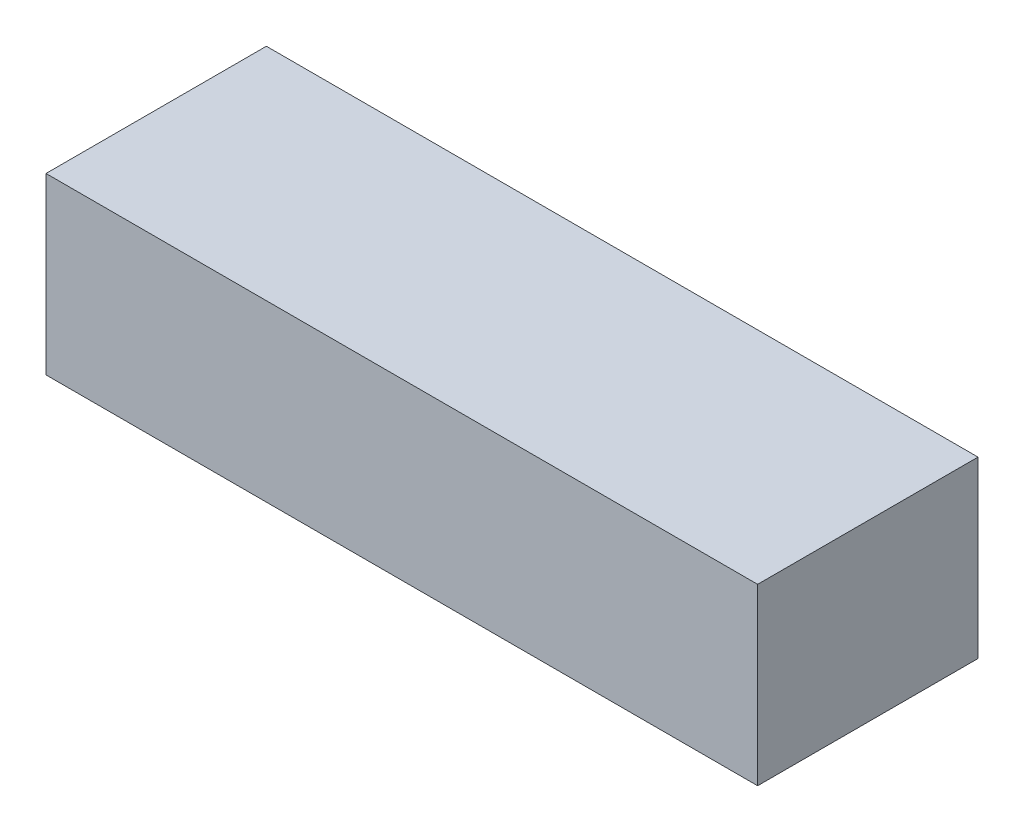
ISO-10303-21;
HEADER;
FILE_DESCRIPTION(('STEP AP214'),'2;1');
FILE_NAME('part.step','',(''),(''),'','','');
FILE_SCHEMA(('AUTOMOTIVE_DESIGN { 1 0 10303 214 1 1 1 1 }'));
ENDSEC;
DATA;
#1=APPLICATION_CONTEXT('core data for automotive mechanical design processes');
#2=APPLICATION_PROTOCOL_DEFINITION('international standard','automotive_design',2000,#1);
#3=PRODUCT_CONTEXT('',#1,'mechanical');
#4=PRODUCT('Part','Part','',(#3));
#5=PRODUCT_RELATED_PRODUCT_CATEGORY('part','',(#4));
#6=PRODUCT_DEFINITION_FORMATION('','',#4);
#7=PRODUCT_DEFINITION_CONTEXT('part definition',#1,'design');
#8=PRODUCT_DEFINITION('design','',#6,#7);
#9=PRODUCT_DEFINITION_SHAPE('','',#8);
#10=(LENGTH_UNIT() NAMED_UNIT(*) SI_UNIT(.MILLI.,.METRE.));
#11=(NAMED_UNIT(*) PLANE_ANGLE_UNIT() SI_UNIT($,.RADIAN.));
#12=(NAMED_UNIT(*) SI_UNIT($,.STERADIAN.) SOLID_ANGLE_UNIT());
#13=UNCERTAINTY_MEASURE_WITH_UNIT(LENGTH_MEASURE(1.E-05),#10,'distance_accuracy_value','');
#14=(GEOMETRIC_REPRESENTATION_CONTEXT(3) GLOBAL_UNCERTAINTY_ASSIGNED_CONTEXT((#13)) GLOBAL_UNIT_ASSIGNED_CONTEXT((#10,
#11,#12)) REPRESENTATION_CONTEXT('',''));
#15=CARTESIAN_POINT('',(0.,0.,0.));
#16=DIRECTION('',(0.,0.,1.));
#17=DIRECTION('',(1.,0.,0.));
#18=AXIS2_PLACEMENT_3D('',#15,#16,#17);
#19=CARTESIAN_POINT('',(-77.5,38.,-24.));
#20=DIRECTION('',(1.,0.,0.));
#21=DIRECTION('',(0.,0.,-1.));
#22=AXIS2_PLACEMENT_3D('',#19,#20,#21);
#23=PLANE('',#22);
#24=DIRECTION('',(0.,0.,1.));
#25=VECTOR('',#24,1.);
#26=CARTESIAN_POINT('',(-77.5,0.,-24.));
#27=LINE('',#26,#25);
#28=CARTESIAN_POINT('',(-77.5,0.,-24.));
#29=VERTEX_POINT('',#28);
#30=CARTESIAN_POINT('',(-77.5,0.,24.));
#31=VERTEX_POINT('',#30);
#32=EDGE_CURVE('E102',#29,#31,#27,.T.);
#33=ORIENTED_EDGE('',*,*,#32,.T.);
#34=DIRECTION('',(0.,-1.,0.));
#35=VECTOR('',#34,1.);
#36=CARTESIAN_POINT('',(-77.5,38.,24.));
#37=LINE('',#36,#35);
#38=CARTESIAN_POINT('',(-77.5,38.,24.));
#39=VERTEX_POINT('',#38);
#40=EDGE_CURVE('E11',#39,#31,#37,.T.);
#41=ORIENTED_EDGE('',*,*,#40,.F.);
#42=DIRECTION('',(0.,0.,1.));
#43=VECTOR('',#42,1.);
#44=CARTESIAN_POINT('',(-77.5,38.,-24.));
#45=LINE('',#44,#43);
#46=CARTESIAN_POINT('',(-77.5,38.,-24.));
#47=VERTEX_POINT('',#46);
#48=EDGE_CURVE('E90',#47,#39,#45,.T.);
#49=ORIENTED_EDGE('',*,*,#48,.F.);
#50=DIRECTION('',(0.,-1.,0.));
#51=VECTOR('',#50,1.);
#52=CARTESIAN_POINT('',(-77.5,38.,-24.));
#53=LINE('',#52,#51);
#54=EDGE_CURVE('E98',#47,#29,#53,.T.);
#55=ORIENTED_EDGE('',*,*,#54,.T.);
#56=EDGE_LOOP('',(#33,#41,#49,#55));
#57=FACE_BOUND('',#56,.T.);
#58=ADVANCED_FACE('F39',(#57),#23,.F.);
#59=CARTESIAN_POINT('',(-77.5,38.,24.));
#60=DIRECTION('',(0.,0.,-1.));
#61=DIRECTION('',(-1.,0.,0.));
#62=AXIS2_PLACEMENT_3D('',#59,#60,#61);
#63=PLANE('',#62);
#64=DIRECTION('',(1.,0.,0.));
#65=VECTOR('',#64,1.);
#66=CARTESIAN_POINT('',(-77.5,0.,24.));
#67=LINE('',#66,#65);
#68=CARTESIAN_POINT('',(77.5,0.,24.));
#69=VERTEX_POINT('',#68);
#70=EDGE_CURVE('E94',#31,#69,#67,.T.);
#71=ORIENTED_EDGE('',*,*,#70,.T.);
#72=DIRECTION('',(0.,-1.,0.));
#73=VECTOR('',#72,1.);
#74=CARTESIAN_POINT('',(77.5,38.,24.));
#75=LINE('',#74,#73);
#76=CARTESIAN_POINT('',(77.5,38.,24.));
#77=VERTEX_POINT('',#76);
#78=EDGE_CURVE('E47',#77,#69,#75,.T.);
#79=ORIENTED_EDGE('',*,*,#78,.F.);
#80=DIRECTION('',(1.,0.,0.));
#81=VECTOR('',#80,1.);
#82=CARTESIAN_POINT('',(-77.5,38.,24.));
#83=LINE('',#82,#81);
#84=EDGE_CURVE('E85',#39,#77,#83,.T.);
#85=ORIENTED_EDGE('',*,*,#84,.F.);
#86=ORIENTED_EDGE('',*,*,#40,.T.);
#87=EDGE_LOOP('',(#71,#79,#85,#86));
#88=FACE_BOUND('',#87,.T.);
#89=ADVANCED_FACE('F93',(#88),#63,.F.);
#90=CARTESIAN_POINT('',(77.5,38.,-24.));
#91=DIRECTION('',(-1.,0.,0.));
#92=DIRECTION('',(0.,0.,1.));
#93=AXIS2_PLACEMENT_3D('',#90,#91,#92);
#94=PLANE('',#93);
#95=DIRECTION('',(0.,0.,-1.));
#96=VECTOR('',#95,1.);
#97=CARTESIAN_POINT('',(77.5,0.,-24.));
#98=LINE('',#97,#96);
#99=CARTESIAN_POINT('',(77.5,0.,-24.));
#100=VERTEX_POINT('',#99);
#101=EDGE_CURVE('E72',#69,#100,#98,.T.);
#102=ORIENTED_EDGE('',*,*,#101,.T.);
#103=DIRECTION('',(0.,-1.,0.));
#104=VECTOR('',#103,1.);
#105=CARTESIAN_POINT('',(77.5,38.,-24.));
#106=LINE('',#105,#104);
#107=CARTESIAN_POINT('',(77.5,38.,-24.));
#108=VERTEX_POINT('',#107);
#109=EDGE_CURVE('E95',#108,#100,#106,.T.);
#110=ORIENTED_EDGE('',*,*,#109,.F.);
#111=DIRECTION('',(0.,0.,-1.));
#112=VECTOR('',#111,1.);
#113=CARTESIAN_POINT('',(77.5,38.,-24.));
#114=LINE('',#113,#112);
#115=EDGE_CURVE('E88',#77,#108,#114,.T.);
#116=ORIENTED_EDGE('',*,*,#115,.F.);
#117=ORIENTED_EDGE('',*,*,#78,.T.);
#118=EDGE_LOOP('',(#102,#110,#116,#117));
#119=FACE_BOUND('',#118,.T.);
#120=ADVANCED_FACE('F96',(#119),#94,.F.);
#121=CARTESIAN_POINT('',(-77.5,38.,-24.));
#122=DIRECTION('',(0.,0.,1.));
#123=DIRECTION('',(1.,0.,0.));
#124=AXIS2_PLACEMENT_3D('',#121,#122,#123);
#125=PLANE('',#124);
#126=DIRECTION('',(-1.,0.,0.));
#127=VECTOR('',#126,1.);
#128=CARTESIAN_POINT('',(-77.5,0.,-24.));
#129=LINE('',#128,#127);
#130=EDGE_CURVE('E78',#100,#29,#129,.T.);
#131=ORIENTED_EDGE('',*,*,#130,.T.);
#132=ORIENTED_EDGE('',*,*,#54,.F.);
#133=DIRECTION('',(-1.,0.,0.));
#134=VECTOR('',#133,1.);
#135=CARTESIAN_POINT('',(-77.5,38.,-24.));
#136=LINE('',#135,#134);
#137=EDGE_CURVE('E55',#108,#47,#136,.T.);
#138=ORIENTED_EDGE('',*,*,#137,.F.);
#139=ORIENTED_EDGE('',*,*,#109,.T.);
#140=EDGE_LOOP('',(#131,#132,#138,#139));
#141=FACE_BOUND('',#140,.T.);
#142=ADVANCED_FACE('F109',(#141),#125,.F.);
#143=CARTESIAN_POINT('',(0.,38.,0.));
#144=DIRECTION('',(0.,1.,0.));
#145=DIRECTION('',(0.,0.,1.));
#146=AXIS2_PLACEMENT_3D('',#143,#144,#145);
#147=PLANE('',#146);
#148=ORIENTED_EDGE('',*,*,#48,.T.);
#149=ORIENTED_EDGE('',*,*,#84,.T.);
#150=ORIENTED_EDGE('',*,*,#115,.T.);
#151=ORIENTED_EDGE('',*,*,#137,.T.);
#152=EDGE_LOOP('',(#148,#149,#150,#151));
#153=FACE_BOUND('',#152,.T.);
#154=ADVANCED_FACE('F86',(#153),#147,.T.);
#155=CARTESIAN_POINT('',(0.,0.,0.));
#156=DIRECTION('',(0.,1.,0.));
#157=DIRECTION('',(0.,0.,1.));
#158=AXIS2_PLACEMENT_3D('',#155,#156,#157);
#159=PLANE('',#158);
#160=ORIENTED_EDGE('',*,*,#32,.F.);
#161=ORIENTED_EDGE('',*,*,#130,.F.);
#162=ORIENTED_EDGE('',*,*,#101,.F.);
#163=ORIENTED_EDGE('',*,*,#70,.F.);
#164=EDGE_LOOP('',(#160,#161,#162,#163));
#165=FACE_BOUND('',#164,.T.);
#166=ADVANCED_FACE('F112',(#165),#159,.F.);
#167=CLOSED_SHELL('',(#58,#89,#120,#142,#154,#166));
#168=MANIFOLD_SOLID_BREP('B2',#167);
#169=ADVANCED_BREP_SHAPE_REPRESENTATION('',(#18,#168),#14);
#170=SHAPE_DEFINITION_REPRESENTATION(#9,#169);
ENDSEC;
END-ISO-10303-21;
